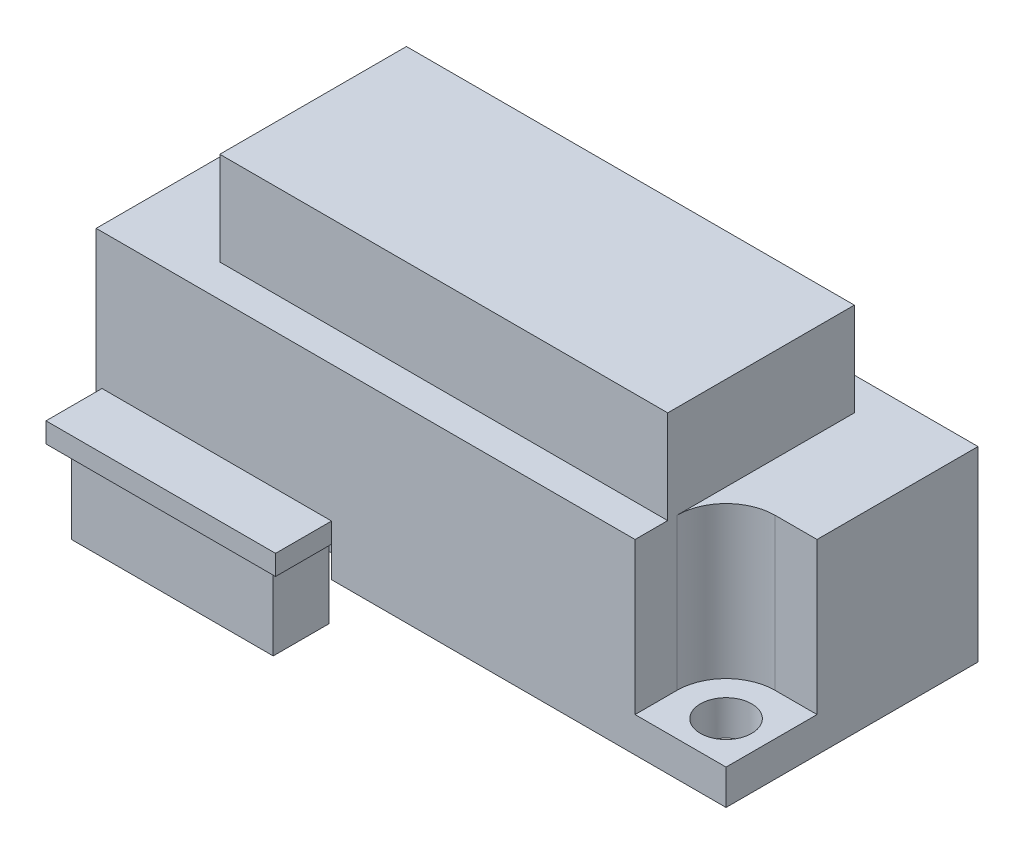
ISO-10303-21;
HEADER;
FILE_DESCRIPTION(('STEP AP214'),'2;1');
FILE_NAME('part.step','',(''),(''),'','','');
FILE_SCHEMA(('AUTOMOTIVE_DESIGN { 1 0 10303 214 1 1 1 1 }'));
ENDSEC;
DATA;
#1=APPLICATION_CONTEXT('core data for automotive mechanical design processes');
#2=APPLICATION_PROTOCOL_DEFINITION('international standard','automotive_design',2000,#1);
#3=PRODUCT_CONTEXT('',#1,'mechanical');
#4=PRODUCT('Part','Part','',(#3));
#5=PRODUCT_RELATED_PRODUCT_CATEGORY('part','',(#4));
#6=PRODUCT_DEFINITION_FORMATION('','',#4);
#7=PRODUCT_DEFINITION_CONTEXT('part definition',#1,'design');
#8=PRODUCT_DEFINITION('design','',#6,#7);
#9=PRODUCT_DEFINITION_SHAPE('','',#8);
#10=(LENGTH_UNIT() NAMED_UNIT(*) SI_UNIT(.MILLI.,.METRE.));
#11=(NAMED_UNIT(*) PLANE_ANGLE_UNIT() SI_UNIT($,.RADIAN.));
#12=(NAMED_UNIT(*) SI_UNIT($,.STERADIAN.) SOLID_ANGLE_UNIT());
#13=UNCERTAINTY_MEASURE_WITH_UNIT(LENGTH_MEASURE(1.E-05),#10,'distance_accuracy_value','');
#14=(GEOMETRIC_REPRESENTATION_CONTEXT(3) GLOBAL_UNCERTAINTY_ASSIGNED_CONTEXT((#13)) GLOBAL_UNIT_ASSIGNED_CONTEXT((#10,
#11,#12)) REPRESENTATION_CONTEXT('',''));
#15=CARTESIAN_POINT('',(0.,0.,0.));
#16=DIRECTION('',(0.,0.,1.));
#17=DIRECTION('',(1.,0.,0.));
#18=AXIS2_PLACEMENT_3D('',#15,#16,#17);
#19=CARTESIAN_POINT('',(0.249999999999997,2.18,-1.));
#20=DIRECTION('',(-1.,0.,0.));
#21=DIRECTION('',(0.,0.,1.));
#22=AXIS2_PLACEMENT_3D('',#19,#20,#21);
#23=PLANE('',#22);
#24=DIRECTION('',(0.,1.,0.));
#25=VECTOR('',#24,1.);
#26=CARTESIAN_POINT('',(0.249999999999997,12.,0.));
#27=LINE('',#26,#25);
#28=CARTESIAN_POINT('',(0.249999999999997,1.32,0.));
#29=VERTEX_POINT('',#28);
#30=CARTESIAN_POINT('',(0.249999999999997,2.18,0.));
#31=VERTEX_POINT('',#30);
#32=EDGE_CURVE('E292',#29,#31,#27,.T.);
#33=ORIENTED_EDGE('',*,*,#32,.F.);
#34=DIRECTION('',(0.,0.,-1.));
#35=VECTOR('',#34,1.);
#36=CARTESIAN_POINT('',(0.249999999999997,1.32,-1.));
#37=LINE('',#36,#35);
#38=CARTESIAN_POINT('',(0.249999999999997,1.32,2.4));
#39=VERTEX_POINT('',#38);
#40=EDGE_CURVE('E260',#39,#29,#37,.T.);
#41=ORIENTED_EDGE('',*,*,#40,.F.);
#42=DIRECTION('',(0.,-1.,0.));
#43=VECTOR('',#42,1.);
#44=CARTESIAN_POINT('',(0.249999999999997,2.18,2.4));
#45=LINE('',#44,#43);
#46=CARTESIAN_POINT('',(0.249999999999997,2.18,2.4));
#47=VERTEX_POINT('',#46);
#48=EDGE_CURVE('E284',#47,#39,#45,.T.);
#49=ORIENTED_EDGE('',*,*,#48,.F.);
#50=DIRECTION('',(0.,0.,-1.));
#51=VECTOR('',#50,1.);
#52=CARTESIAN_POINT('',(0.249999999999997,2.18,-1.));
#53=LINE('',#52,#51);
#54=EDGE_CURVE('E275',#47,#31,#53,.T.);
#55=ORIENTED_EDGE('',*,*,#54,.T.);
#56=EDGE_LOOP('',(#33,#41,#49,#55));
#57=FACE_BOUND('',#56,.T.);
#58=ADVANCED_FACE('F36',(#57),#23,.T.);
#59=CARTESIAN_POINT('',(10.09,2.18,-1.));
#60=DIRECTION('',(1.,0.,0.));
#61=DIRECTION('',(0.,0.,-1.));
#62=AXIS2_PLACEMENT_3D('',#59,#60,#61);
#63=PLANE('',#62);
#64=DIRECTION('',(0.,-1.,0.));
#65=VECTOR('',#64,1.);
#66=CARTESIAN_POINT('',(10.09,2.18,2.4));
#67=LINE('',#66,#65);
#68=CARTESIAN_POINT('',(10.09,2.18,2.4));
#69=VERTEX_POINT('',#68);
#70=CARTESIAN_POINT('',(10.09,1.32,2.4));
#71=VERTEX_POINT('',#70);
#72=EDGE_CURVE('E283',#69,#71,#67,.T.);
#73=ORIENTED_EDGE('',*,*,#72,.T.);
#74=DIRECTION('',(0.,0.,1.));
#75=VECTOR('',#74,1.);
#76=CARTESIAN_POINT('',(10.09,1.32,-1.));
#77=LINE('',#76,#75);
#78=CARTESIAN_POINT('',(10.09,1.32,0.));
#79=VERTEX_POINT('',#78);
#80=EDGE_CURVE('E51',#79,#71,#77,.T.);
#81=ORIENTED_EDGE('',*,*,#80,.F.);
#82=DIRECTION('',(0.,-1.,0.));
#83=VECTOR('',#82,1.);
#84=CARTESIAN_POINT('',(10.09,12.,0.));
#85=LINE('',#84,#83);
#86=CARTESIAN_POINT('',(10.09,2.18,0.));
#87=VERTEX_POINT('',#86);
#88=EDGE_CURVE('E287',#87,#79,#85,.T.);
#89=ORIENTED_EDGE('',*,*,#88,.F.);
#90=DIRECTION('',(0.,0.,1.));
#91=VECTOR('',#90,1.);
#92=CARTESIAN_POINT('',(10.09,2.18,-1.));
#93=LINE('',#92,#91);
#94=EDGE_CURVE('E278',#87,#69,#93,.T.);
#95=ORIENTED_EDGE('',*,*,#94,.T.);
#96=EDGE_LOOP('',(#73,#81,#89,#95));
#97=FACE_BOUND('',#96,.T.);
#98=ADVANCED_FACE('F463',(#97),#63,.T.);
#99=CARTESIAN_POINT('',(0.249999999999997,2.18,2.4));
#100=DIRECTION('',(0.,0.,1.));
#101=DIRECTION('',(1.,0.,0.));
#102=AXIS2_PLACEMENT_3D('',#99,#100,#101);
#103=PLANE('',#102);
#104=ORIENTED_EDGE('',*,*,#48,.T.);
#105=DIRECTION('',(-1.,0.,0.));
#106=VECTOR('',#105,1.);
#107=CARTESIAN_POINT('',(10.09,1.32,2.4));
#108=LINE('',#107,#106);
#109=EDGE_CURVE('E257',#71,#39,#108,.T.);
#110=ORIENTED_EDGE('',*,*,#109,.F.);
#111=ORIENTED_EDGE('',*,*,#72,.F.);
#112=DIRECTION('',(-1.,0.,0.));
#113=VECTOR('',#112,1.);
#114=CARTESIAN_POINT('',(0.249999999999997,2.18,2.4));
#115=LINE('',#114,#113);
#116=EDGE_CURVE('E280',#69,#47,#115,.T.);
#117=ORIENTED_EDGE('',*,*,#116,.T.);
#118=EDGE_LOOP('',(#104,#110,#111,#117));
#119=FACE_BOUND('',#118,.T.);
#120=ADVANCED_FACE('F470',(#119),#103,.T.);
#121=CARTESIAN_POINT('',(0.,12.,0.));
#122=DIRECTION('',(0.,-1.,0.));
#123=DIRECTION('',(0.,0.,-1.));
#124=AXIS2_PLACEMENT_3D('',#121,#122,#123);
#125=PLANE('',#124);
#126=DIRECTION('',(-1.,0.,0.));
#127=VECTOR('',#126,1.);
#128=CARTESIAN_POINT('',(3.9,12.,-9.4));
#129=LINE('',#128,#127);
#130=CARTESIAN_POINT('',(23.1,12.,-9.4));
#131=VERTEX_POINT('',#130);
#132=CARTESIAN_POINT('',(3.9,12.,-9.4));
#133=VERTEX_POINT('',#132);
#134=EDGE_CURVE('E297',#131,#133,#129,.T.);
#135=ORIENTED_EDGE('',*,*,#134,.T.);
#136=DIRECTION('',(0.,0.,-1.));
#137=VECTOR('',#136,1.);
#138=CARTESIAN_POINT('',(3.9,12.,-10.8));
#139=LINE('',#138,#137);
#140=CARTESIAN_POINT('',(3.9,12.,-1.4));
#141=VERTEX_POINT('',#140);
#142=EDGE_CURVE('E397',#141,#133,#139,.T.);
#143=ORIENTED_EDGE('',*,*,#142,.F.);
#144=DIRECTION('',(1.,0.,0.));
#145=VECTOR('',#144,1.);
#146=CARTESIAN_POINT('',(3.9,12.,-1.4));
#147=LINE('',#146,#145);
#148=CARTESIAN_POINT('',(23.1,12.,-1.4));
#149=VERTEX_POINT('',#148);
#150=EDGE_CURVE('E302',#141,#149,#147,.T.);
#151=ORIENTED_EDGE('',*,*,#150,.T.);
#152=DIRECTION('',(0.,0.,1.));
#153=VECTOR('',#152,1.);
#154=CARTESIAN_POINT('',(23.1,12.,-10.8));
#155=LINE('',#154,#153);
#156=EDGE_CURVE('E385',#131,#149,#155,.T.);
#157=ORIENTED_EDGE('',*,*,#156,.F.);
#158=EDGE_LOOP('',(#135,#143,#151,#157));
#159=FACE_BOUND('',#158,.T.);
#160=ADVANCED_FACE('F515',(#159),#125,.F.);
#161=CARTESIAN_POINT('',(0.,12.,0.));
#162=DIRECTION('',(1.,0.,0.));
#163=DIRECTION('',(0.,0.,-1.));
#164=AXIS2_PLACEMENT_3D('',#161,#162,#163);
#165=PLANE('',#164);
#166=DIRECTION('',(0.,0.,1.));
#167=VECTOR('',#166,1.);
#168=CARTESIAN_POINT('',(0.,8.,-10.8));
#169=LINE('',#168,#167);
#170=CARTESIAN_POINT('',(0.,8.,-6.9));
#171=VERTEX_POINT('',#170);
#172=CARTESIAN_POINT('',(0.,8.,0.));
#173=VERTEX_POINT('',#172);
#174=EDGE_CURVE('E398',#171,#173,#169,.T.);
#175=ORIENTED_EDGE('',*,*,#174,.F.);
#176=DIRECTION('',(0.,1.,0.));
#177=VECTOR('',#176,1.);
#178=CARTESIAN_POINT('',(0.,1.5,-6.9));
#179=LINE('',#178,#177);
#180=CARTESIAN_POINT('',(0.,1.5,-6.9));
#181=VERTEX_POINT('',#180);
#182=EDGE_CURVE('E349',#181,#171,#179,.T.);
#183=ORIENTED_EDGE('',*,*,#182,.F.);
#184=DIRECTION('',(0.,0.,1.));
#185=VECTOR('',#184,1.);
#186=CARTESIAN_POINT('',(0.,1.5,-10.8));
#187=LINE('',#186,#185);
#188=CARTESIAN_POINT('',(0.,1.5,-10.8));
#189=VERTEX_POINT('',#188);
#190=EDGE_CURVE('E334',#189,#181,#187,.T.);
#191=ORIENTED_EDGE('',*,*,#190,.F.);
#192=DIRECTION('',(0.,-1.,0.));
#193=VECTOR('',#192,1.);
#194=CARTESIAN_POINT('',(0.,12.,-10.8));
#195=LINE('',#194,#193);
#196=CARTESIAN_POINT('',(0.,0.,-10.8));
#197=VERTEX_POINT('',#196);
#198=EDGE_CURVE('E422',#189,#197,#195,.T.);
#199=ORIENTED_EDGE('',*,*,#198,.T.);
#200=DIRECTION('',(0.,0.,1.));
#201=VECTOR('',#200,1.);
#202=CARTESIAN_POINT('',(0.,0.,0.));
#203=LINE('',#202,#201);
#204=CARTESIAN_POINT('',(0.,0.,0.));
#205=VERTEX_POINT('',#204);
#206=EDGE_CURVE('E409',#197,#205,#203,.T.);
#207=ORIENTED_EDGE('',*,*,#206,.T.);
#208=DIRECTION('',(0.,-1.,0.));
#209=VECTOR('',#208,1.);
#210=CARTESIAN_POINT('',(0.,12.,0.));
#211=LINE('',#210,#209);
#212=EDGE_CURVE('E429',#173,#205,#211,.T.);
#213=ORIENTED_EDGE('',*,*,#212,.F.);
#214=EDGE_LOOP('',(#175,#183,#191,#199,#207,#213));
#215=FACE_BOUND('',#214,.T.);
#216=ADVANCED_FACE('F38',(#215),#165,.F.);
#217=CARTESIAN_POINT('',(0.,12.,0.));
#218=DIRECTION('',(0.,0.,-1.));
#219=DIRECTION('',(-1.,0.,0.));
#220=AXIS2_PLACEMENT_3D('',#217,#218,#219);
#221=PLANE('',#220);
#222=DIRECTION('',(1.,0.,0.));
#223=VECTOR('',#222,1.);
#224=CARTESIAN_POINT('',(0.,0.,0.));
#225=LINE('',#224,#223);
#226=CARTESIAN_POINT('',(0.249999999999997,0.,0.));
#227=VERTEX_POINT('',#226);
#228=EDGE_CURVE('E413',#205,#227,#225,.T.);
#229=ORIENTED_EDGE('',*,*,#228,.T.);
#230=EDGE_CURVE('E293',#227,#29,#27,.T.);
#231=ORIENTED_EDGE('',*,*,#230,.T.);
#232=ORIENTED_EDGE('',*,*,#32,.T.);
#233=DIRECTION('',(1.,0.,0.));
#234=VECTOR('',#233,1.);
#235=CARTESIAN_POINT('',(0.,2.18,0.));
#236=LINE('',#235,#234);
#237=EDGE_CURVE('E12',#31,#87,#236,.T.);
#238=ORIENTED_EDGE('',*,*,#237,.T.);
#239=ORIENTED_EDGE('',*,*,#88,.T.);
#240=DIRECTION('',(0.,-1.,0.));
#241=VECTOR('',#240,1.);
#242=CARTESIAN_POINT('',(10.09,12.,0.));
#243=LINE('',#242,#241);
#244=CARTESIAN_POINT('',(10.09,0.,0.));
#245=VERTEX_POINT('',#244);
#246=EDGE_CURVE('E270',#79,#245,#243,.T.);
#247=ORIENTED_EDGE('',*,*,#246,.T.);
#248=CARTESIAN_POINT('',(27.,0.,0.));
#249=VERTEX_POINT('',#248);
#250=EDGE_CURVE('E412',#245,#249,#225,.T.);
#251=ORIENTED_EDGE('',*,*,#250,.T.);
#252=DIRECTION('',(0.,-1.,0.));
#253=VECTOR('',#252,1.);
#254=CARTESIAN_POINT('',(27.,12.,0.));
#255=LINE('',#254,#253);
#256=CARTESIAN_POINT('',(27.,1.5,0.));
#257=VERTEX_POINT('',#256);
#258=EDGE_CURVE('E426',#257,#249,#255,.T.);
#259=ORIENTED_EDGE('',*,*,#258,.F.);
#260=DIRECTION('',(1.,0.,0.));
#261=VECTOR('',#260,1.);
#262=CARTESIAN_POINT('',(27.,1.5,0.));
#263=LINE('',#262,#261);
#264=CARTESIAN_POINT('',(23.1,1.5,0.));
#265=VERTEX_POINT('',#264);
#266=EDGE_CURVE('E366',#265,#257,#263,.T.);
#267=ORIENTED_EDGE('',*,*,#266,.F.);
#268=DIRECTION('',(0.,1.,0.));
#269=VECTOR('',#268,1.);
#270=CARTESIAN_POINT('',(23.1,8.,0.));
#271=LINE('',#270,#269);
#272=CARTESIAN_POINT('',(23.1,8.,0.));
#273=VERTEX_POINT('',#272);
#274=EDGE_CURVE('E392',#265,#273,#271,.T.);
#275=ORIENTED_EDGE('',*,*,#274,.T.);
#276=DIRECTION('',(1.,0.,0.));
#277=VECTOR('',#276,1.);
#278=CARTESIAN_POINT('',(0.,8.,0.));
#279=LINE('',#278,#277);
#280=EDGE_CURVE('E400',#173,#273,#279,.T.);
#281=ORIENTED_EDGE('',*,*,#280,.F.);
#282=ORIENTED_EDGE('',*,*,#212,.T.);
#283=EDGE_LOOP('',(#229,#231,#232,#238,#239,#247,#251,#259,#267,#275,#281,#282));
#284=FACE_BOUND('',#283,.T.);
#285=ADVANCED_FACE('F457',(#284),#221,.F.);
#286=CARTESIAN_POINT('',(27.,12.,0.));
#287=DIRECTION('',(-1.,0.,0.));
#288=DIRECTION('',(0.,0.,1.));
#289=AXIS2_PLACEMENT_3D('',#286,#287,#288);
#290=PLANE('',#289);
#291=DIRECTION('',(0.,0.,-1.));
#292=VECTOR('',#291,1.);
#293=CARTESIAN_POINT('',(27.,8.,-10.8));
#294=LINE('',#293,#292);
#295=CARTESIAN_POINT('',(27.,8.,-3.9));
#296=VERTEX_POINT('',#295);
#297=CARTESIAN_POINT('',(27.,8.,-10.8));
#298=VERTEX_POINT('',#297);
#299=EDGE_CURVE('E386',#296,#298,#294,.T.);
#300=ORIENTED_EDGE('',*,*,#299,.F.);
#301=DIRECTION('',(0.,1.,0.));
#302=VECTOR('',#301,1.);
#303=CARTESIAN_POINT('',(27.,1.5,-3.9));
#304=LINE('',#303,#302);
#305=CARTESIAN_POINT('',(27.,1.5,-3.9));
#306=VERTEX_POINT('',#305);
#307=EDGE_CURVE('E368',#306,#296,#304,.T.);
#308=ORIENTED_EDGE('',*,*,#307,.F.);
#309=DIRECTION('',(0.,0.,-1.));
#310=VECTOR('',#309,1.);
#311=CARTESIAN_POINT('',(27.,1.5,-3.9));
#312=LINE('',#311,#310);
#313=EDGE_CURVE('E353',#257,#306,#312,.T.);
#314=ORIENTED_EDGE('',*,*,#313,.F.);
#315=ORIENTED_EDGE('',*,*,#258,.T.);
#316=DIRECTION('',(0.,0.,-1.));
#317=VECTOR('',#316,1.);
#318=CARTESIAN_POINT('',(27.,0.,0.));
#319=LINE('',#318,#317);
#320=CARTESIAN_POINT('',(27.,0.,-10.8));
#321=VERTEX_POINT('',#320);
#322=EDGE_CURVE('E416',#249,#321,#319,.T.);
#323=ORIENTED_EDGE('',*,*,#322,.T.);
#324=DIRECTION('',(0.,-1.,0.));
#325=VECTOR('',#324,1.);
#326=CARTESIAN_POINT('',(27.,12.,-10.8));
#327=LINE('',#326,#325);
#328=EDGE_CURVE('E424',#298,#321,#327,.T.);
#329=ORIENTED_EDGE('',*,*,#328,.F.);
#330=EDGE_LOOP('',(#300,#308,#314,#315,#323,#329));
#331=FACE_BOUND('',#330,.T.);
#332=ADVANCED_FACE('F490',(#331),#290,.F.);
#333=CARTESIAN_POINT('',(0.,12.,-10.8));
#334=DIRECTION('',(0.,0.,1.));
#335=DIRECTION('',(1.,0.,0.));
#336=AXIS2_PLACEMENT_3D('',#333,#334,#335);
#337=PLANE('',#336);
#338=DIRECTION('',(0.,1.,0.));
#339=VECTOR('',#338,1.);
#340=CARTESIAN_POINT('',(3.9,8.,-10.8));
#341=LINE('',#340,#339);
#342=CARTESIAN_POINT('',(3.9,1.5,-10.8));
#343=VERTEX_POINT('',#342);
#344=CARTESIAN_POINT('',(3.9,8.,-10.8));
#345=VERTEX_POINT('',#344);
#346=EDGE_CURVE('E404',#343,#345,#341,.T.);
#347=ORIENTED_EDGE('',*,*,#346,.T.);
#348=DIRECTION('',(-1.,0.,0.));
#349=VECTOR('',#348,1.);
#350=CARTESIAN_POINT('',(27.,8.,-10.8));
#351=LINE('',#350,#349);
#352=EDGE_CURVE('E388',#298,#345,#351,.T.);
#353=ORIENTED_EDGE('',*,*,#352,.F.);
#354=ORIENTED_EDGE('',*,*,#328,.T.);
#355=DIRECTION('',(-1.,0.,0.));
#356=VECTOR('',#355,1.);
#357=CARTESIAN_POINT('',(0.,0.,-10.8));
#358=LINE('',#357,#356);
#359=EDGE_CURVE('E419',#321,#197,#358,.T.);
#360=ORIENTED_EDGE('',*,*,#359,.T.);
#361=ORIENTED_EDGE('',*,*,#198,.F.);
#362=DIRECTION('',(-1.,0.,0.));
#363=VECTOR('',#362,1.);
#364=CARTESIAN_POINT('',(3.9,1.5,-10.8));
#365=LINE('',#364,#363);
#366=EDGE_CURVE('E332',#343,#189,#365,.T.);
#367=ORIENTED_EDGE('',*,*,#366,.F.);
#368=EDGE_LOOP('',(#347,#353,#354,#360,#361,#367));
#369=FACE_BOUND('',#368,.T.);
#370=ADVANCED_FACE('F485',(#369),#337,.F.);
#371=CARTESIAN_POINT('',(0.,0.,0.));
#372=DIRECTION('',(0.,-1.,0.));
#373=DIRECTION('',(0.,0.,-1.));
#374=AXIS2_PLACEMENT_3D('',#371,#372,#373);
#375=PLANE('',#374);
#376=DIRECTION('',(0.,0.,-1.));
#377=VECTOR('',#376,1.);
#378=CARTESIAN_POINT('',(0.249999999999997,0.,0.));
#379=LINE('',#378,#377);
#380=CARTESIAN_POINT('',(0.249999999999997,0.,-1.));
#381=VERTEX_POINT('',#380);
#382=EDGE_CURVE('E44',#227,#381,#379,.T.);
#383=ORIENTED_EDGE('',*,*,#382,.F.);
#384=ORIENTED_EDGE('',*,*,#228,.F.);
#385=ORIENTED_EDGE('',*,*,#206,.F.);
#386=ORIENTED_EDGE('',*,*,#359,.F.);
#387=ORIENTED_EDGE('',*,*,#322,.F.);
#388=ORIENTED_EDGE('',*,*,#250,.F.);
#389=DIRECTION('',(0.,0.,1.));
#390=VECTOR('',#389,1.);
#391=CARTESIAN_POINT('',(10.09,0.,0.));
#392=LINE('',#391,#390);
#393=CARTESIAN_POINT('',(10.09,0.,-1.));
#394=VERTEX_POINT('',#393);
#395=EDGE_CURVE('E437',#394,#245,#392,.T.);
#396=ORIENTED_EDGE('',*,*,#395,.F.);
#397=DIRECTION('',(1.,0.,0.));
#398=VECTOR('',#397,1.);
#399=CARTESIAN_POINT('',(0.,0.,-1.));
#400=LINE('',#399,#398);
#401=EDGE_CURVE('E431',#381,#394,#400,.T.);
#402=ORIENTED_EDGE('',*,*,#401,.F.);
#403=EDGE_LOOP('',(#383,#384,#385,#386,#387,#388,#396,#402));
#404=FACE_BOUND('',#403,.T.);
#405=CARTESIAN_POINT('',(1.8,0.,-9.));
#406=DIRECTION('',(0.,1.,0.));
#407=DIRECTION('',(0.,0.,1.));
#408=AXIS2_PLACEMENT_3D('',#405,#406,#407);
#409=CIRCLE('',#408,1.1);
#410=CARTESIAN_POINT('',(1.8,0.,-7.9));
#411=VERTEX_POINT('',#410);
#412=EDGE_CURVE('E378',#411,#411,#409,.T.);
#413=ORIENTED_EDGE('',*,*,#412,.T.);
#414=EDGE_LOOP('',(#413));
#415=FACE_BOUND('',#414,.T.);
#416=CARTESIAN_POINT('',(25.2,0.,-1.8));
#417=DIRECTION('',(0.,1.,0.));
#418=DIRECTION('',(0.,0.,1.));
#419=AXIS2_PLACEMENT_3D('',#416,#417,#418);
#420=CIRCLE('',#419,1.1);
#421=CARTESIAN_POINT('',(25.2,0.,-0.700000000000001));
#422=VERTEX_POINT('',#421);
#423=EDGE_CURVE('E381',#422,#422,#420,.T.);
#424=ORIENTED_EDGE('',*,*,#423,.T.);
#425=EDGE_LOOP('',(#424));
#426=FACE_BOUND('',#425,.T.);
#427=ADVANCED_FACE('F449',(#404,#415,#426),#375,.T.);
#428=CARTESIAN_POINT('',(3.9,8.,-10.8));
#429=DIRECTION('',(1.,0.,0.));
#430=DIRECTION('',(0.,0.,-1.));
#431=AXIS2_PLACEMENT_3D('',#428,#429,#430);
#432=PLANE('',#431);
#433=DIRECTION('',(0.,1.,0.));
#434=VECTOR('',#433,1.);
#435=CARTESIAN_POINT('',(3.9,1.5,-9.));
#436=LINE('',#435,#434);
#437=CARTESIAN_POINT('',(3.9,1.5,-9.));
#438=VERTEX_POINT('',#437);
#439=CARTESIAN_POINT('',(3.9,8.,-9.));
#440=VERTEX_POINT('',#439);
#441=EDGE_CURVE('E339',#438,#440,#436,.T.);
#442=ORIENTED_EDGE('',*,*,#441,.T.);
#443=DIRECTION('',(0.,0.,-1.));
#444=VECTOR('',#443,1.);
#445=CARTESIAN_POINT('',(3.9,8.,-10.8));
#446=LINE('',#445,#444);
#447=CARTESIAN_POINT('',(3.9,8.,-1.4));
#448=VERTEX_POINT('',#447);
#449=EDGE_CURVE('E402',#448,#440,#446,.T.);
#450=ORIENTED_EDGE('',*,*,#449,.F.);
#451=DIRECTION('',(0.,1.,0.));
#452=VECTOR('',#451,1.);
#453=CARTESIAN_POINT('',(3.9,-21.9216051658792,-1.4));
#454=LINE('',#453,#452);
#455=EDGE_CURVE('E306',#448,#141,#454,.T.);
#456=ORIENTED_EDGE('',*,*,#455,.T.);
#457=ORIENTED_EDGE('',*,*,#142,.T.);
#458=DIRECTION('',(0.,1.,0.));
#459=VECTOR('',#458,1.);
#460=CARTESIAN_POINT('',(3.9,-21.9216051658792,-9.4));
#461=LINE('',#460,#459);
#462=CARTESIAN_POINT('',(3.9,8.,-9.4));
#463=VERTEX_POINT('',#462);
#464=EDGE_CURVE('E296',#463,#133,#461,.T.);
#465=ORIENTED_EDGE('',*,*,#464,.F.);
#466=DIRECTION('',(0.,0.,-1.));
#467=VECTOR('',#466,1.);
#468=CARTESIAN_POINT('',(3.9,8.,-10.8));
#469=LINE('',#468,#467);
#470=EDGE_CURVE('E312',#463,#345,#469,.T.);
#471=ORIENTED_EDGE('',*,*,#470,.T.);
#472=ORIENTED_EDGE('',*,*,#346,.F.);
#473=DIRECTION('',(0.,0.,-1.));
#474=VECTOR('',#473,1.);
#475=CARTESIAN_POINT('',(3.9,1.5,-9.));
#476=LINE('',#475,#474);
#477=EDGE_CURVE('E328',#438,#343,#476,.T.);
#478=ORIENTED_EDGE('',*,*,#477,.F.);
#479=EDGE_LOOP('',(#442,#450,#456,#457,#465,#471,#472,#478));
#480=FACE_BOUND('',#479,.T.);
#481=ADVANCED_FACE('F512',(#480),#432,.F.);
#482=CARTESIAN_POINT('',(0.,8.,0.));
#483=DIRECTION('',(0.,1.,0.));
#484=DIRECTION('',(0.,0.,1.));
#485=AXIS2_PLACEMENT_3D('',#482,#483,#484);
#486=PLANE('',#485);
#487=CARTESIAN_POINT('',(1.8,8.,-9.));
#488=DIRECTION('',(0.,1.,0.));
#489=DIRECTION('',(0.,0.,-1.));
#490=AXIS2_PLACEMENT_3D('',#487,#488,#489);
#491=CIRCLE('',#490,2.1);
#492=CARTESIAN_POINT('',(1.8,8.,-6.9));
#493=VERTEX_POINT('',#492);
#494=EDGE_CURVE('E340',#493,#440,#491,.T.);
#495=ORIENTED_EDGE('',*,*,#494,.F.);
#496=DIRECTION('',(1.,0.,0.));
#497=VECTOR('',#496,1.);
#498=CARTESIAN_POINT('',(1.8,8.,-6.9));
#499=LINE('',#498,#497);
#500=EDGE_CURVE('E329',#171,#493,#499,.T.);
#501=ORIENTED_EDGE('',*,*,#500,.F.);
#502=ORIENTED_EDGE('',*,*,#174,.T.);
#503=ORIENTED_EDGE('',*,*,#280,.T.);
#504=DIRECTION('',(0.,0.,1.));
#505=VECTOR('',#504,1.);
#506=CARTESIAN_POINT('',(23.1,8.,-10.8));
#507=LINE('',#506,#505);
#508=CARTESIAN_POINT('',(23.1,8.,-1.4));
#509=VERTEX_POINT('',#508);
#510=EDGE_CURVE('E321',#509,#273,#507,.T.);
#511=ORIENTED_EDGE('',*,*,#510,.F.);
#512=DIRECTION('',(1.,0.,0.));
#513=VECTOR('',#512,1.);
#514=CARTESIAN_POINT('',(3.9,8.,-1.4));
#515=LINE('',#514,#513);
#516=EDGE_CURVE('E309',#448,#509,#515,.T.);
#517=ORIENTED_EDGE('',*,*,#516,.F.);
#518=ORIENTED_EDGE('',*,*,#449,.T.);
#519=EDGE_LOOP('',(#495,#501,#502,#503,#511,#517,#518));
#520=FACE_BOUND('',#519,.T.);
#521=ADVANCED_FACE('F506',(#520),#486,.T.);
#522=CARTESIAN_POINT('',(23.1,8.,-10.8));
#523=DIRECTION('',(-1.,0.,0.));
#524=DIRECTION('',(0.,0.,1.));
#525=AXIS2_PLACEMENT_3D('',#522,#523,#524);
#526=PLANE('',#525);
#527=DIRECTION('',(0.,1.,0.));
#528=VECTOR('',#527,1.);
#529=CARTESIAN_POINT('',(23.1,1.5,-1.8));
#530=LINE('',#529,#528);
#531=CARTESIAN_POINT('',(23.1,1.5,-1.8));
#532=VERTEX_POINT('',#531);
#533=CARTESIAN_POINT('',(23.1,8.,-1.8));
#534=VERTEX_POINT('',#533);
#535=EDGE_CURVE('E343',#532,#534,#530,.T.);
#536=ORIENTED_EDGE('',*,*,#535,.T.);
#537=DIRECTION('',(0.,0.,1.));
#538=VECTOR('',#537,1.);
#539=CARTESIAN_POINT('',(23.1,8.,-10.8));
#540=LINE('',#539,#538);
#541=CARTESIAN_POINT('',(23.1,8.,-9.4));
#542=VERTEX_POINT('',#541);
#543=EDGE_CURVE('E390',#542,#534,#540,.T.);
#544=ORIENTED_EDGE('',*,*,#543,.F.);
#545=DIRECTION('',(0.,1.,0.));
#546=VECTOR('',#545,1.);
#547=CARTESIAN_POINT('',(23.1,-21.9216051658792,-9.4));
#548=LINE('',#547,#546);
#549=EDGE_CURVE('E301',#542,#131,#548,.T.);
#550=ORIENTED_EDGE('',*,*,#549,.T.);
#551=ORIENTED_EDGE('',*,*,#156,.T.);
#552=DIRECTION('',(0.,1.,0.));
#553=VECTOR('',#552,1.);
#554=CARTESIAN_POINT('',(23.1,-21.9216051658792,-1.4));
#555=LINE('',#554,#553);
#556=EDGE_CURVE('E300',#509,#149,#555,.T.);
#557=ORIENTED_EDGE('',*,*,#556,.F.);
#558=ORIENTED_EDGE('',*,*,#510,.T.);
#559=ORIENTED_EDGE('',*,*,#274,.F.);
#560=DIRECTION('',(0.,0.,1.));
#561=VECTOR('',#560,1.);
#562=CARTESIAN_POINT('',(23.1,1.5,0.));
#563=LINE('',#562,#561);
#564=EDGE_CURVE('E363',#532,#265,#563,.T.);
#565=ORIENTED_EDGE('',*,*,#564,.F.);
#566=EDGE_LOOP('',(#536,#544,#550,#551,#557,#558,#559,#565));
#567=FACE_BOUND('',#566,.T.);
#568=ADVANCED_FACE('F500',(#567),#526,.F.);
#569=CARTESIAN_POINT('',(0.,8.,0.));
#570=DIRECTION('',(0.,-1.,0.));
#571=DIRECTION('',(0.,0.,-1.));
#572=AXIS2_PLACEMENT_3D('',#569,#570,#571);
#573=PLANE('',#572);
#574=ORIENTED_EDGE('',*,*,#352,.T.);
#575=ORIENTED_EDGE('',*,*,#470,.F.);
#576=DIRECTION('',(-1.,0.,0.));
#577=VECTOR('',#576,1.);
#578=CARTESIAN_POINT('',(3.9,8.,-9.4));
#579=LINE('',#578,#577);
#580=EDGE_CURVE('E305',#542,#463,#579,.T.);
#581=ORIENTED_EDGE('',*,*,#580,.F.);
#582=ORIENTED_EDGE('',*,*,#543,.T.);
#583=CARTESIAN_POINT('',(25.2,8.,-1.8));
#584=DIRECTION('',(0.,1.,0.));
#585=DIRECTION('',(0.,0.,-1.));
#586=AXIS2_PLACEMENT_3D('',#583,#584,#585);
#587=CIRCLE('',#586,2.1);
#588=CARTESIAN_POINT('',(25.2,8.,-3.9));
#589=VERTEX_POINT('',#588);
#590=EDGE_CURVE('E357',#589,#534,#587,.T.);
#591=ORIENTED_EDGE('',*,*,#590,.F.);
#592=DIRECTION('',(-1.,0.,0.));
#593=VECTOR('',#592,1.);
#594=CARTESIAN_POINT('',(25.2,8.,-3.9));
#595=LINE('',#594,#593);
#596=EDGE_CURVE('E324',#296,#589,#595,.T.);
#597=ORIENTED_EDGE('',*,*,#596,.F.);
#598=ORIENTED_EDGE('',*,*,#299,.T.);
#599=EDGE_LOOP('',(#574,#575,#581,#582,#591,#597,#598));
#600=FACE_BOUND('',#599,.T.);
#601=ADVANCED_FACE('F522',(#600),#573,.F.);
#602=CARTESIAN_POINT('',(25.2,0.,-1.8));
#603=DIRECTION('',(0.,1.,0.));
#604=DIRECTION('',(0.,0.,1.));
#605=AXIS2_PLACEMENT_3D('',#602,#603,#604);
#606=CYLINDRICAL_SURFACE('',#605,1.1);
#607=CARTESIAN_POINT('',(25.2,1.5,-1.8));
#608=DIRECTION('',(0.,-1.,0.));
#609=DIRECTION('',(0.,0.,-1.));
#610=AXIS2_PLACEMENT_3D('',#607,#608,#609);
#611=CIRCLE('',#610,1.1);
#612=CARTESIAN_POINT('',(25.2,1.5,-2.9));
#613=VERTEX_POINT('',#612);
#614=EDGE_CURVE('E382',#613,#613,#611,.F.);
#615=ORIENTED_EDGE('',*,*,#614,.T.);
#616=EDGE_LOOP('',(#615));
#617=FACE_BOUND('',#616,.T.);
#618=ORIENTED_EDGE('',*,*,#423,.F.);
#619=EDGE_LOOP('',(#618));
#620=FACE_BOUND('',#619,.T.);
#621=ADVANCED_FACE('F562',(#617,#620),#606,.F.);
#622=CARTESIAN_POINT('',(1.8,0.,-9.));
#623=DIRECTION('',(0.,1.,0.));
#624=DIRECTION('',(0.,0.,1.));
#625=AXIS2_PLACEMENT_3D('',#622,#623,#624);
#626=CYLINDRICAL_SURFACE('',#625,1.1);
#627=CARTESIAN_POINT('',(1.8,1.5,-9.));
#628=DIRECTION('',(0.,-1.,0.));
#629=DIRECTION('',(0.,0.,-1.));
#630=AXIS2_PLACEMENT_3D('',#627,#628,#629);
#631=CIRCLE('',#630,1.1);
#632=CARTESIAN_POINT('',(1.8,1.5,-10.1));
#633=VERTEX_POINT('',#632);
#634=EDGE_CURVE('E348',#633,#633,#631,.F.);
#635=ORIENTED_EDGE('',*,*,#634,.T.);
#636=EDGE_LOOP('',(#635));
#637=FACE_BOUND('',#636,.T.);
#638=ORIENTED_EDGE('',*,*,#412,.F.);
#639=EDGE_LOOP('',(#638));
#640=FACE_BOUND('',#639,.T.);
#641=ADVANCED_FACE('F558',(#637,#640),#626,.F.);
#642=CARTESIAN_POINT('',(1.8,1.5,-9.));
#643=DIRECTION('',(0.,-1.,0.));
#644=DIRECTION('',(0.,0.,-1.));
#645=AXIS2_PLACEMENT_3D('',#642,#643,#644);
#646=PLANE('',#645);
#647=CARTESIAN_POINT('',(1.8,1.5,-9.));
#648=DIRECTION('',(0.,1.,0.));
#649=DIRECTION('',(0.,0.,-1.));
#650=AXIS2_PLACEMENT_3D('',#647,#648,#649);
#651=CIRCLE('',#650,2.1);
#652=CARTESIAN_POINT('',(1.8,1.5,-6.9));
#653=VERTEX_POINT('',#652);
#654=EDGE_CURVE('E325',#653,#438,#651,.T.);
#655=ORIENTED_EDGE('',*,*,#654,.T.);
#656=ORIENTED_EDGE('',*,*,#477,.T.);
#657=ORIENTED_EDGE('',*,*,#366,.T.);
#658=ORIENTED_EDGE('',*,*,#190,.T.);
#659=DIRECTION('',(1.,0.,0.));
#660=VECTOR('',#659,1.);
#661=CARTESIAN_POINT('',(1.8,1.5,-6.9));
#662=LINE('',#661,#660);
#663=EDGE_CURVE('E336',#181,#653,#662,.T.);
#664=ORIENTED_EDGE('',*,*,#663,.T.);
#665=EDGE_LOOP('',(#655,#656,#657,#658,#664));
#666=FACE_BOUND('',#665,.T.);
#667=ORIENTED_EDGE('',*,*,#634,.F.);
#668=EDGE_LOOP('',(#667));
#669=FACE_BOUND('',#668,.T.);
#670=ADVANCED_FACE('F526',(#666,#669),#646,.F.);
#671=CARTESIAN_POINT('',(1.8,1.5,-9.));
#672=DIRECTION('',(0.,1.,0.));
#673=DIRECTION('',(0.,0.,1.));
#674=AXIS2_PLACEMENT_3D('',#671,#672,#673);
#675=CYLINDRICAL_SURFACE('',#674,2.1);
#676=ORIENTED_EDGE('',*,*,#494,.T.);
#677=ORIENTED_EDGE('',*,*,#441,.F.);
#678=ORIENTED_EDGE('',*,*,#654,.F.);
#679=DIRECTION('',(0.,1.,0.));
#680=VECTOR('',#679,1.);
#681=CARTESIAN_POINT('',(1.8,1.5,-6.9));
#682=LINE('',#681,#680);
#683=EDGE_CURVE('E346',#653,#493,#682,.T.);
#684=ORIENTED_EDGE('',*,*,#683,.T.);
#685=EDGE_LOOP('',(#676,#677,#678,#684));
#686=FACE_BOUND('',#685,.T.);
#687=ADVANCED_FACE('F531',(#686),#675,.F.);
#688=CARTESIAN_POINT('',(1.8,1.5,-6.9));
#689=DIRECTION('',(0.,0.,1.));
#690=DIRECTION('',(1.,0.,0.));
#691=AXIS2_PLACEMENT_3D('',#688,#689,#690);
#692=PLANE('',#691);
#693=ORIENTED_EDGE('',*,*,#500,.T.);
#694=ORIENTED_EDGE('',*,*,#683,.F.);
#695=ORIENTED_EDGE('',*,*,#663,.F.);
#696=ORIENTED_EDGE('',*,*,#182,.T.);
#697=EDGE_LOOP('',(#693,#694,#695,#696));
#698=FACE_BOUND('',#697,.T.);
#699=ADVANCED_FACE('F534',(#698),#692,.F.);
#700=CARTESIAN_POINT('',(25.2,1.5,-1.8));
#701=DIRECTION('',(0.,-1.,0.));
#702=DIRECTION('',(0.,0.,-1.));
#703=AXIS2_PLACEMENT_3D('',#700,#701,#702);
#704=PLANE('',#703);
#705=ORIENTED_EDGE('',*,*,#313,.T.);
#706=DIRECTION('',(-1.,0.,0.));
#707=VECTOR('',#706,1.);
#708=CARTESIAN_POINT('',(25.2,1.5,-3.9));
#709=LINE('',#708,#707);
#710=CARTESIAN_POINT('',(25.2,1.5,-3.9));
#711=VERTEX_POINT('',#710);
#712=EDGE_CURVE('E356',#306,#711,#709,.T.);
#713=ORIENTED_EDGE('',*,*,#712,.T.);
#714=CARTESIAN_POINT('',(25.2,1.5,-1.8));
#715=DIRECTION('',(0.,1.,0.));
#716=DIRECTION('',(0.,0.,-1.));
#717=AXIS2_PLACEMENT_3D('',#714,#715,#716);
#718=CIRCLE('',#717,2.1);
#719=EDGE_CURVE('E360',#711,#532,#718,.T.);
#720=ORIENTED_EDGE('',*,*,#719,.T.);
#721=ORIENTED_EDGE('',*,*,#564,.T.);
#722=ORIENTED_EDGE('',*,*,#266,.T.);
#723=EDGE_LOOP('',(#705,#713,#720,#721,#722));
#724=FACE_BOUND('',#723,.T.);
#725=ORIENTED_EDGE('',*,*,#614,.F.);
#726=EDGE_LOOP('',(#725));
#727=FACE_BOUND('',#726,.T.);
#728=ADVANCED_FACE('F495',(#724,#727),#704,.F.);
#729=CARTESIAN_POINT('',(25.2,1.5,-1.8));
#730=DIRECTION('',(0.,1.,0.));
#731=DIRECTION('',(0.,0.,1.));
#732=AXIS2_PLACEMENT_3D('',#729,#730,#731);
#733=CYLINDRICAL_SURFACE('',#732,2.1);
#734=ORIENTED_EDGE('',*,*,#590,.T.);
#735=ORIENTED_EDGE('',*,*,#535,.F.);
#736=ORIENTED_EDGE('',*,*,#719,.F.);
#737=DIRECTION('',(0.,1.,0.));
#738=VECTOR('',#737,1.);
#739=CARTESIAN_POINT('',(25.2,1.5,-3.9));
#740=LINE('',#739,#738);
#741=EDGE_CURVE('E375',#711,#589,#740,.T.);
#742=ORIENTED_EDGE('',*,*,#741,.T.);
#743=EDGE_LOOP('',(#734,#735,#736,#742));
#744=FACE_BOUND('',#743,.T.);
#745=ADVANCED_FACE('F541',(#744),#733,.F.);
#746=CARTESIAN_POINT('',(25.2,1.5,-3.9));
#747=DIRECTION('',(0.,0.,-1.));
#748=DIRECTION('',(-1.,0.,0.));
#749=AXIS2_PLACEMENT_3D('',#746,#747,#748);
#750=PLANE('',#749);
#751=ORIENTED_EDGE('',*,*,#596,.T.);
#752=ORIENTED_EDGE('',*,*,#741,.F.);
#753=ORIENTED_EDGE('',*,*,#712,.F.);
#754=ORIENTED_EDGE('',*,*,#307,.T.);
#755=EDGE_LOOP('',(#751,#752,#753,#754));
#756=FACE_BOUND('',#755,.T.);
#757=ADVANCED_FACE('F555',(#756),#750,.F.);
#758=CARTESIAN_POINT('',(3.9,-21.9216051658792,-1.4));
#759=DIRECTION('',(0.,0.,1.));
#760=DIRECTION('',(1.,0.,0.));
#761=AXIS2_PLACEMENT_3D('',#758,#759,#760);
#762=PLANE('',#761);
#763=ORIENTED_EDGE('',*,*,#516,.T.);
#764=ORIENTED_EDGE('',*,*,#556,.T.);
#765=ORIENTED_EDGE('',*,*,#150,.F.);
#766=ORIENTED_EDGE('',*,*,#455,.F.);
#767=EDGE_LOOP('',(#763,#764,#765,#766));
#768=FACE_BOUND('',#767,.T.);
#769=ADVANCED_FACE('F509',(#768),#762,.T.);
#770=CARTESIAN_POINT('',(3.9,-21.9216051658792,-9.4));
#771=DIRECTION('',(0.,0.,-1.));
#772=DIRECTION('',(-1.,0.,0.));
#773=AXIS2_PLACEMENT_3D('',#770,#771,#772);
#774=PLANE('',#773);
#775=ORIENTED_EDGE('',*,*,#580,.T.);
#776=ORIENTED_EDGE('',*,*,#464,.T.);
#777=ORIENTED_EDGE('',*,*,#134,.F.);
#778=ORIENTED_EDGE('',*,*,#549,.F.);
#779=EDGE_LOOP('',(#775,#776,#777,#778));
#780=FACE_BOUND('',#779,.T.);
#781=ADVANCED_FACE('F518',(#780),#774,.T.);
#782=CARTESIAN_POINT('',(0.,2.18,0.));
#783=DIRECTION('',(0.,1.,0.));
#784=DIRECTION('',(0.,0.,1.));
#785=AXIS2_PLACEMENT_3D('',#782,#783,#784);
#786=PLANE('',#785);
#787=ORIENTED_EDGE('',*,*,#237,.F.);
#788=ORIENTED_EDGE('',*,*,#54,.F.);
#789=ORIENTED_EDGE('',*,*,#116,.F.);
#790=ORIENTED_EDGE('',*,*,#94,.F.);
#791=EDGE_LOOP('',(#787,#788,#789,#790));
#792=FACE_BOUND('',#791,.T.);
#793=ADVANCED_FACE('F467',(#792),#786,.T.);
#794=CARTESIAN_POINT('',(10.09,1.32,-1.));
#795=DIRECTION('',(1.,0.,0.));
#796=DIRECTION('',(0.,0.,-1.));
#797=AXIS2_PLACEMENT_3D('',#794,#795,#796);
#798=PLANE('',#797);
#799=CARTESIAN_POINT('',(10.09,1.32,-1.));
#800=VERTEX_POINT('',#799);
#801=EDGE_CURVE('E255',#800,#79,#77,.T.);
#802=ORIENTED_EDGE('',*,*,#801,.F.);
#803=DIRECTION('',(0.,-1.,0.));
#804=VECTOR('',#803,1.);
#805=CARTESIAN_POINT('',(10.09,1.32,-1.));
#806=LINE('',#805,#804);
#807=EDGE_CURVE('E267',#800,#394,#806,.T.);
#808=ORIENTED_EDGE('',*,*,#807,.T.);
#809=ORIENTED_EDGE('',*,*,#395,.T.);
#810=ORIENTED_EDGE('',*,*,#246,.F.);
#811=EDGE_LOOP('',(#802,#808,#809,#810));
#812=FACE_BOUND('',#811,.T.);
#813=ADVANCED_FACE('F455',(#812),#798,.F.);
#814=CARTESIAN_POINT('',(0.249999999999997,1.32,-1.));
#815=DIRECTION('',(-1.,0.,0.));
#816=DIRECTION('',(0.,0.,1.));
#817=AXIS2_PLACEMENT_3D('',#814,#815,#816);
#818=PLANE('',#817);
#819=ORIENTED_EDGE('',*,*,#382,.T.);
#820=DIRECTION('',(0.,-1.,0.));
#821=VECTOR('',#820,1.);
#822=CARTESIAN_POINT('',(0.249999999999997,1.32,-1.));
#823=LINE('',#822,#821);
#824=CARTESIAN_POINT('',(0.249999999999997,1.32,-1.));
#825=VERTEX_POINT('',#824);
#826=EDGE_CURVE('E266',#825,#381,#823,.T.);
#827=ORIENTED_EDGE('',*,*,#826,.F.);
#828=EDGE_CURVE('E259',#29,#825,#37,.T.);
#829=ORIENTED_EDGE('',*,*,#828,.F.);
#830=ORIENTED_EDGE('',*,*,#230,.F.);
#831=EDGE_LOOP('',(#819,#827,#829,#830));
#832=FACE_BOUND('',#831,.T.);
#833=ADVANCED_FACE('F441',(#832),#818,.F.);
#834=CARTESIAN_POINT('',(10.09,1.32,-1.));
#835=DIRECTION('',(0.,0.,-1.));
#836=DIRECTION('',(-1.,0.,0.));
#837=AXIS2_PLACEMENT_3D('',#834,#835,#836);
#838=PLANE('',#837);
#839=ORIENTED_EDGE('',*,*,#401,.T.);
#840=ORIENTED_EDGE('',*,*,#807,.F.);
#841=DIRECTION('',(1.,0.,0.));
#842=VECTOR('',#841,1.);
#843=CARTESIAN_POINT('',(10.09,1.32,-1.));
#844=LINE('',#843,#842);
#845=EDGE_CURVE('E263',#825,#800,#844,.T.);
#846=ORIENTED_EDGE('',*,*,#845,.F.);
#847=ORIENTED_EDGE('',*,*,#826,.T.);
#848=EDGE_LOOP('',(#839,#840,#846,#847));
#849=FACE_BOUND('',#848,.T.);
#850=ADVANCED_FACE('F447',(#849),#838,.F.);
#851=CARTESIAN_POINT('',(0.,1.32,0.));
#852=DIRECTION('',(0.,-1.,0.));
#853=DIRECTION('',(0.,0.,-1.));
#854=AXIS2_PLACEMENT_3D('',#851,#852,#853);
#855=PLANE('',#854);
#856=DIRECTION('',(1.,0.,0.));
#857=VECTOR('',#856,1.);
#858=CARTESIAN_POINT('',(9.49,1.32,-0.5));
#859=LINE('',#858,#857);
#860=CARTESIAN_POINT('',(0.849999999999997,1.32,-0.500000000000001));
#861=VERTEX_POINT('',#860);
#862=CARTESIAN_POINT('',(9.49,1.32,-0.5));
#863=VERTEX_POINT('',#862);
#864=EDGE_CURVE('E227',#861,#863,#859,.T.);
#865=ORIENTED_EDGE('',*,*,#864,.F.);
#866=DIRECTION('',(0.,0.,-1.));
#867=VECTOR('',#866,1.);
#868=CARTESIAN_POINT('',(0.849999999999997,1.32,1.9));
#869=LINE('',#868,#867);
#870=CARTESIAN_POINT('',(0.849999999999997,1.32,1.9));
#871=VERTEX_POINT('',#870);
#872=EDGE_CURVE('E236',#871,#861,#869,.T.);
#873=ORIENTED_EDGE('',*,*,#872,.F.);
#874=DIRECTION('',(-1.,0.,0.));
#875=VECTOR('',#874,1.);
#876=CARTESIAN_POINT('',(9.49,1.32,1.9));
#877=LINE('',#876,#875);
#878=CARTESIAN_POINT('',(9.49,1.32,1.9));
#879=VERTEX_POINT('',#878);
#880=EDGE_CURVE('E219',#879,#871,#877,.T.);
#881=ORIENTED_EDGE('',*,*,#880,.F.);
#882=DIRECTION('',(0.,0.,1.));
#883=VECTOR('',#882,1.);
#884=CARTESIAN_POINT('',(9.49,1.32,1.9));
#885=LINE('',#884,#883);
#886=EDGE_CURVE('E233',#863,#879,#885,.T.);
#887=ORIENTED_EDGE('',*,*,#886,.F.);
#888=EDGE_LOOP('',(#865,#873,#881,#887));
#889=FACE_BOUND('',#888,.T.);
#890=ORIENTED_EDGE('',*,*,#801,.T.);
#891=ORIENTED_EDGE('',*,*,#80,.T.);
#892=ORIENTED_EDGE('',*,*,#109,.T.);
#893=ORIENTED_EDGE('',*,*,#40,.T.);
#894=ORIENTED_EDGE('',*,*,#828,.T.);
#895=ORIENTED_EDGE('',*,*,#845,.T.);
#896=EDGE_LOOP('',(#890,#891,#892,#893,#894,#895));
#897=FACE_BOUND('',#896,.T.);
#898=ADVANCED_FACE('F232',(#889,#897),#855,.T.);
#899=CARTESIAN_POINT('',(9.49,1.32,1.9));
#900=DIRECTION('',(1.,0.,0.));
#901=DIRECTION('',(0.,0.,-1.));
#902=AXIS2_PLACEMENT_3D('',#899,#900,#901);
#903=PLANE('',#902);
#904=DIRECTION('',(0.,0.,1.));
#905=VECTOR('',#904,1.);
#906=CARTESIAN_POINT('',(9.49,-2.18,1.9));
#907=LINE('',#906,#905);
#908=CARTESIAN_POINT('',(9.49,-2.18,-0.5));
#909=VERTEX_POINT('',#908);
#910=CARTESIAN_POINT('',(9.49,-2.18,1.9));
#911=VERTEX_POINT('',#910);
#912=EDGE_CURVE('E247',#909,#911,#907,.T.);
#913=ORIENTED_EDGE('',*,*,#912,.F.);
#914=DIRECTION('',(0.,-1.,0.));
#915=VECTOR('',#914,1.);
#916=CARTESIAN_POINT('',(9.49,1.32,-0.5));
#917=LINE('',#916,#915);
#918=EDGE_CURVE('E239',#863,#909,#917,.T.);
#919=ORIENTED_EDGE('',*,*,#918,.F.);
#920=ORIENTED_EDGE('',*,*,#886,.T.);
#921=DIRECTION('',(0.,-1.,0.));
#922=VECTOR('',#921,1.);
#923=CARTESIAN_POINT('',(9.49,1.32,1.9));
#924=LINE('',#923,#922);
#925=EDGE_CURVE('E216',#879,#911,#924,.T.);
#926=ORIENTED_EDGE('',*,*,#925,.T.);
#927=EDGE_LOOP('',(#913,#919,#920,#926));
#928=FACE_BOUND('',#927,.T.);
#929=ADVANCED_FACE('F238',(#928),#903,.T.);
#930=CARTESIAN_POINT('',(9.49,1.32,-0.5));
#931=DIRECTION('',(0.,0.,-1.));
#932=DIRECTION('',(-1.,0.,0.));
#933=AXIS2_PLACEMENT_3D('',#930,#931,#932);
#934=PLANE('',#933);
#935=DIRECTION('',(1.,0.,0.));
#936=VECTOR('',#935,1.);
#937=CARTESIAN_POINT('',(9.49,-2.18,-0.5));
#938=LINE('',#937,#936);
#939=CARTESIAN_POINT('',(0.849999999999997,-2.18,-0.500000000000001));
#940=VERTEX_POINT('',#939);
#941=EDGE_CURVE('E240',#940,#909,#938,.T.);
#942=ORIENTED_EDGE('',*,*,#941,.F.);
#943=DIRECTION('',(0.,-1.,0.));
#944=VECTOR('',#943,1.);
#945=CARTESIAN_POINT('',(0.849999999999997,1.32,-0.500000000000001));
#946=LINE('',#945,#944);
#947=EDGE_CURVE('E252',#861,#940,#946,.T.);
#948=ORIENTED_EDGE('',*,*,#947,.F.);
#949=ORIENTED_EDGE('',*,*,#864,.T.);
#950=ORIENTED_EDGE('',*,*,#918,.T.);
#951=EDGE_LOOP('',(#942,#948,#949,#950));
#952=FACE_BOUND('',#951,.T.);
#953=ADVANCED_FACE('F726',(#952),#934,.T.);
#954=CARTESIAN_POINT('',(0.849999999999997,1.32,1.9));
#955=DIRECTION('',(-1.,0.,0.));
#956=DIRECTION('',(0.,0.,1.));
#957=AXIS2_PLACEMENT_3D('',#954,#955,#956);
#958=PLANE('',#957);
#959=DIRECTION('',(0.,0.,-1.));
#960=VECTOR('',#959,1.);
#961=CARTESIAN_POINT('',(0.849999999999997,-2.18,1.9));
#962=LINE('',#961,#960);
#963=CARTESIAN_POINT('',(0.849999999999997,-2.18,1.9));
#964=VERTEX_POINT('',#963);
#965=EDGE_CURVE('E59',#964,#940,#962,.T.);
#966=ORIENTED_EDGE('',*,*,#965,.F.);
#967=DIRECTION('',(0.,-1.,0.));
#968=VECTOR('',#967,1.);
#969=CARTESIAN_POINT('',(0.849999999999997,1.32,1.9));
#970=LINE('',#969,#968);
#971=EDGE_CURVE('E226',#871,#964,#970,.T.);
#972=ORIENTED_EDGE('',*,*,#971,.F.);
#973=ORIENTED_EDGE('',*,*,#872,.T.);
#974=ORIENTED_EDGE('',*,*,#947,.T.);
#975=EDGE_LOOP('',(#966,#972,#973,#974));
#976=FACE_BOUND('',#975,.T.);
#977=ADVANCED_FACE('F738',(#976),#958,.T.);
#978=CARTESIAN_POINT('',(9.49,1.32,1.9));
#979=DIRECTION('',(0.,0.,1.));
#980=DIRECTION('',(1.,0.,0.));
#981=AXIS2_PLACEMENT_3D('',#978,#979,#980);
#982=PLANE('',#981);
#983=DIRECTION('',(-1.,0.,0.));
#984=VECTOR('',#983,1.);
#985=CARTESIAN_POINT('',(9.49,-2.18,1.9));
#986=LINE('',#985,#984);
#987=EDGE_CURVE('E221',#911,#964,#986,.T.);
#988=ORIENTED_EDGE('',*,*,#987,.F.);
#989=ORIENTED_EDGE('',*,*,#925,.F.);
#990=ORIENTED_EDGE('',*,*,#880,.T.);
#991=ORIENTED_EDGE('',*,*,#971,.T.);
#992=EDGE_LOOP('',(#988,#989,#990,#991));
#993=FACE_BOUND('',#992,.T.);
#994=ADVANCED_FACE('F218',(#993),#982,.T.);
#995=CARTESIAN_POINT('',(0.,-2.18,0.));
#996=DIRECTION('',(0.,1.,0.));
#997=DIRECTION('',(0.,0.,1.));
#998=AXIS2_PLACEMENT_3D('',#995,#996,#997);
#999=PLANE('',#998);
#1000=ORIENTED_EDGE('',*,*,#912,.T.);
#1001=ORIENTED_EDGE('',*,*,#987,.T.);
#1002=ORIENTED_EDGE('',*,*,#965,.T.);
#1003=ORIENTED_EDGE('',*,*,#941,.T.);
#1004=EDGE_LOOP('',(#1000,#1001,#1002,#1003));
#1005=FACE_BOUND('',#1004,.T.);
#1006=ADVANCED_FACE('F756',(#1005),#999,.F.);
#1007=CLOSED_SHELL('',(#58,#98,#120,#160,#216,#285,#332,#370,#427,#481,#521,#568,#601,#621,#641,
#670,#687,#699,#728,#745,#757,#769,#781,#793,#813,#833,#850,#898,#929,#953,#977,#994,#1006));
#1008=MANIFOLD_SOLID_BREP('B2',#1007);
#1009=ADVANCED_BREP_SHAPE_REPRESENTATION('',(#18,#1008),#14);
#1010=SHAPE_DEFINITION_REPRESENTATION(#9,#1009);
ENDSEC;
END-ISO-10303-21;
